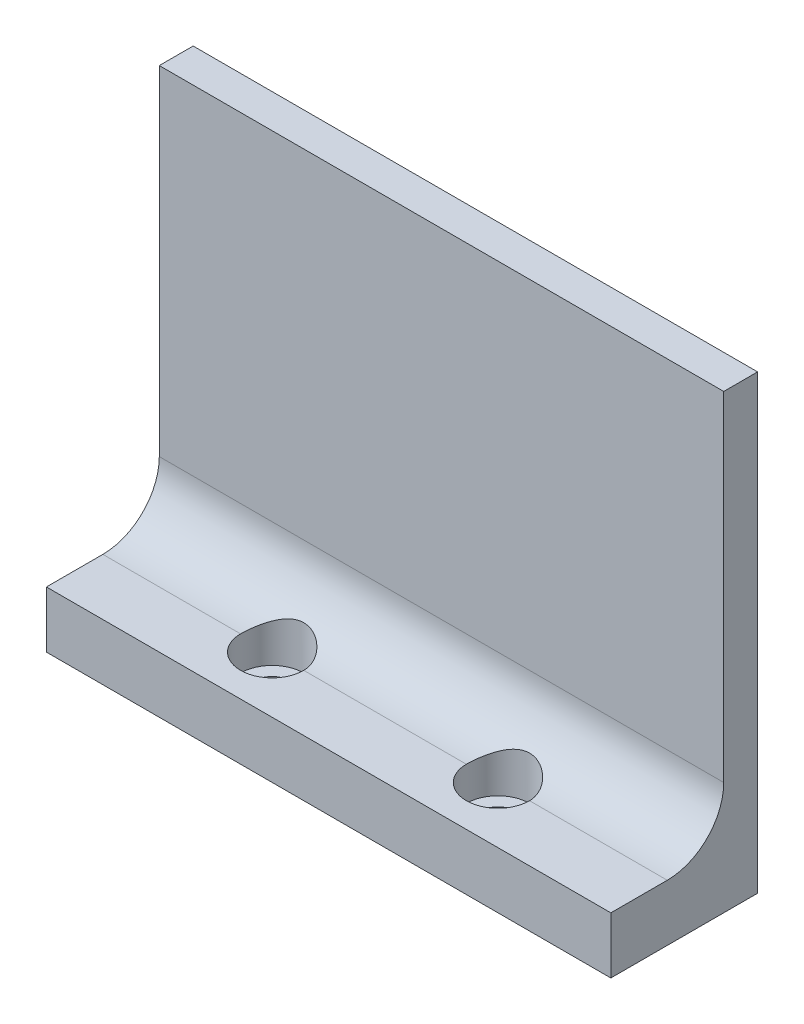
ISO-10303-21;
HEADER;
FILE_DESCRIPTION(('STEP AP214'),'2;1');
FILE_NAME('part.step','',(''),(''),'','','');
FILE_SCHEMA(('AUTOMOTIVE_DESIGN { 1 0 10303 214 1 1 1 1 }'));
ENDSEC;
DATA;
#1=APPLICATION_CONTEXT('core data for automotive mechanical design processes');
#2=APPLICATION_PROTOCOL_DEFINITION('international standard','automotive_design',2000,#1);
#3=PRODUCT_CONTEXT('',#1,'mechanical');
#4=PRODUCT('Part','Part','',(#3));
#5=PRODUCT_RELATED_PRODUCT_CATEGORY('part','',(#4));
#6=PRODUCT_DEFINITION_FORMATION('','',#4);
#7=PRODUCT_DEFINITION_CONTEXT('part definition',#1,'design');
#8=PRODUCT_DEFINITION('design','',#6,#7);
#9=PRODUCT_DEFINITION_SHAPE('','',#8);
#10=(LENGTH_UNIT() NAMED_UNIT(*) SI_UNIT(.MILLI.,.METRE.));
#11=(NAMED_UNIT(*) PLANE_ANGLE_UNIT() SI_UNIT($,.RADIAN.));
#12=(NAMED_UNIT(*) SI_UNIT($,.STERADIAN.) SOLID_ANGLE_UNIT());
#13=UNCERTAINTY_MEASURE_WITH_UNIT(LENGTH_MEASURE(1.E-05),#10,'distance_accuracy_value','');
#14=(GEOMETRIC_REPRESENTATION_CONTEXT(3) GLOBAL_UNCERTAINTY_ASSIGNED_CONTEXT((#13)) GLOBAL_UNIT_ASSIGNED_CONTEXT((#10,
#11,#12)) REPRESENTATION_CONTEXT('',''));
#15=CARTESIAN_POINT('',(0.,0.,0.));
#16=DIRECTION('',(0.,0.,1.));
#17=DIRECTION('',(1.,0.,0.));
#18=AXIS2_PLACEMENT_3D('',#15,#16,#17);
#19=CARTESIAN_POINT('',(30.,0.,-9.99999999999999));
#20=DIRECTION('',(0.,0.,1.));
#21=DIRECTION('',(1.,0.,0.));
#22=AXIS2_PLACEMENT_3D('',#19,#20,#21);
#23=PLANE('',#22);
#24=DIRECTION('',(0.,1.,0.));
#25=VECTOR('',#24,1.);
#26=CARTESIAN_POINT('',(-10.,0.,-10.));
#27=LINE('',#26,#25);
#28=CARTESIAN_POINT('',(-10.,10.,-10.));
#29=VERTEX_POINT('',#28);
#30=CARTESIAN_POINT('',(-10.,40.,-10.));
#31=VERTEX_POINT('',#30);
#32=EDGE_CURVE('E143',#29,#31,#27,.T.);
#33=ORIENTED_EDGE('',*,*,#32,.F.);
#34=DIRECTION('',(-1.,0.,0.));
#35=VECTOR('',#34,1.);
#36=CARTESIAN_POINT('',(30.,10.,-9.99999999999999));
#37=LINE('',#36,#35);
#38=CARTESIAN_POINT('',(40.,10.,-10.));
#39=VERTEX_POINT('',#38);
#40=EDGE_CURVE('E48',#29,#39,#37,.F.);
#41=ORIENTED_EDGE('',*,*,#40,.T.);
#42=DIRECTION('',(0.,-1.,0.));
#43=VECTOR('',#42,1.);
#44=CARTESIAN_POINT('',(40.,40.,-9.99999999999999));
#45=LINE('',#44,#43);
#46=CARTESIAN_POINT('',(40.,40.,-9.99999999999999));
#47=VERTEX_POINT('',#46);
#48=EDGE_CURVE('E137',#47,#39,#45,.T.);
#49=ORIENTED_EDGE('',*,*,#48,.F.);
#50=DIRECTION('',(-1.,0.,0.));
#51=VECTOR('',#50,1.);
#52=CARTESIAN_POINT('',(30.,40.,-9.99999999999999));
#53=LINE('',#52,#51);
#54=EDGE_CURVE('E153',#47,#31,#53,.T.);
#55=ORIENTED_EDGE('',*,*,#54,.T.);
#56=EDGE_LOOP('',(#33,#41,#49,#55));
#57=FACE_BOUND('',#56,.T.);
#58=ADVANCED_FACE('F32',(#57),#23,.T.);
#59=CARTESIAN_POINT('',(5.,5.,-5.));
#60=DIRECTION('',(0.,-1.,0.));
#61=DIRECTION('',(0.,0.,-1.));
#62=AXIS2_PLACEMENT_3D('',#59,#60,#61);
#63=CYLINDRICAL_SURFACE('',#62,1.6);
#64=CARTESIAN_POINT('',(5.,0.,-5.));
#65=DIRECTION('',(0.,1.,0.));
#66=DIRECTION('',(0.,0.,1.));
#67=AXIS2_PLACEMENT_3D('',#64,#65,#66);
#68=CIRCLE('',#67,1.6);
#69=CARTESIAN_POINT('',(5.,0.,-3.4));
#70=VERTEX_POINT('',#69);
#71=EDGE_CURVE('E115',#70,#70,#68,.T.);
#72=ORIENTED_EDGE('',*,*,#71,.F.);
#73=EDGE_LOOP('',(#72));
#74=FACE_BOUND('',#73,.T.);
#75=CARTESIAN_POINT('',(5.,2.,-5.));
#76=DIRECTION('',(0.,1.,0.));
#77=DIRECTION('',(0.,0.,1.));
#78=AXIS2_PLACEMENT_3D('',#75,#76,#77);
#79=CIRCLE('',#78,1.6);
#80=CARTESIAN_POINT('',(5.,2.,-3.4));
#81=VERTEX_POINT('',#80);
#82=EDGE_CURVE('E175',#81,#81,#79,.T.);
#83=ORIENTED_EDGE('',*,*,#82,.T.);
#84=EDGE_LOOP('',(#83));
#85=FACE_BOUND('',#84,.T.);
#86=ADVANCED_FACE('F215',(#74,#85),#63,.F.);
#87=CARTESIAN_POINT('',(25.,5.,-5.));
#88=DIRECTION('',(0.,-1.,0.));
#89=DIRECTION('',(0.,0.,-1.));
#90=AXIS2_PLACEMENT_3D('',#87,#88,#89);
#91=CYLINDRICAL_SURFACE('',#90,1.6);
#92=CARTESIAN_POINT('',(25.,0.,-5.));
#93=DIRECTION('',(0.,1.,0.));
#94=DIRECTION('',(0.,0.,1.));
#95=AXIS2_PLACEMENT_3D('',#92,#93,#94);
#96=CIRCLE('',#95,1.6);
#97=CARTESIAN_POINT('',(25.,0.,-3.4));
#98=VERTEX_POINT('',#97);
#99=EDGE_CURVE('E172',#98,#98,#96,.T.);
#100=ORIENTED_EDGE('',*,*,#99,.F.);
#101=EDGE_LOOP('',(#100));
#102=FACE_BOUND('',#101,.T.);
#103=CARTESIAN_POINT('',(25.,2.,-5.));
#104=DIRECTION('',(0.,1.,0.));
#105=DIRECTION('',(0.,0.,1.));
#106=AXIS2_PLACEMENT_3D('',#103,#104,#105);
#107=CIRCLE('',#106,1.6);
#108=CARTESIAN_POINT('',(25.,2.,-3.4));
#109=VERTEX_POINT('',#108);
#110=EDGE_CURVE('E163',#109,#109,#107,.T.);
#111=ORIENTED_EDGE('',*,*,#110,.T.);
#112=EDGE_LOOP('',(#111));
#113=FACE_BOUND('',#112,.T.);
#114=ADVANCED_FACE('F211',(#102,#113),#91,.F.);
#115=CARTESIAN_POINT('',(0.,5.,0.));
#116=DIRECTION('',(0.,-1.,0.));
#117=DIRECTION('',(0.,0.,-1.));
#118=AXIS2_PLACEMENT_3D('',#115,#116,#117);
#119=PLANE('',#118);
#120=DIRECTION('',(0.,0.,1.));
#121=VECTOR('',#120,1.);
#122=CARTESIAN_POINT('',(40.,5.,-10.));
#123=LINE('',#122,#121);
#124=CARTESIAN_POINT('',(40.,5.,-4.99999999999999));
#125=VERTEX_POINT('',#124);
#126=CARTESIAN_POINT('',(40.,5.,0.));
#127=VERTEX_POINT('',#126);
#128=EDGE_CURVE('E129',#125,#127,#123,.T.);
#129=ORIENTED_EDGE('',*,*,#128,.F.);
#130=DIRECTION('',(-1.,0.,0.));
#131=VECTOR('',#130,1.);
#132=CARTESIAN_POINT('',(0.,5.,-5.));
#133=LINE('',#132,#131);
#134=CARTESIAN_POINT('',(27.8,5.,-4.99999999999999));
#135=VERTEX_POINT('',#134);
#136=EDGE_CURVE('E187',#125,#135,#133,.T.);
#137=ORIENTED_EDGE('',*,*,#136,.T.);
#138=CARTESIAN_POINT('',(25.,5.,-5.));
#139=DIRECTION('',(0.,1.,0.));
#140=DIRECTION('',(0.,0.,1.));
#141=AXIS2_PLACEMENT_3D('',#138,#139,#140);
#142=CIRCLE('',#141,2.8);
#143=CARTESIAN_POINT('',(22.2,5.,-4.99999999999999));
#144=VERTEX_POINT('',#143);
#145=EDGE_CURVE('E155',#144,#135,#142,.T.);
#146=ORIENTED_EDGE('',*,*,#145,.F.);
#147=DIRECTION('',(-1.,0.,0.));
#148=VECTOR('',#147,1.);
#149=CARTESIAN_POINT('',(0.,5.,-5.));
#150=LINE('',#149,#148);
#151=CARTESIAN_POINT('',(7.8,5.,-5.));
#152=VERTEX_POINT('',#151);
#153=EDGE_CURVE('E185',#144,#152,#150,.T.);
#154=ORIENTED_EDGE('',*,*,#153,.T.);
#155=CARTESIAN_POINT('',(5.,5.,-5.));
#156=DIRECTION('',(0.,1.,0.));
#157=DIRECTION('',(0.,0.,1.));
#158=AXIS2_PLACEMENT_3D('',#155,#156,#157);
#159=CIRCLE('',#158,2.8);
#160=CARTESIAN_POINT('',(2.2,5.,-5.));
#161=VERTEX_POINT('',#160);
#162=EDGE_CURVE('E164',#161,#152,#159,.T.);
#163=ORIENTED_EDGE('',*,*,#162,.F.);
#164=DIRECTION('',(-1.,0.,0.));
#165=VECTOR('',#164,1.);
#166=CARTESIAN_POINT('',(0.,5.,-5.));
#167=LINE('',#166,#165);
#168=CARTESIAN_POINT('',(-10.,5.,-5.));
#169=VERTEX_POINT('',#168);
#170=EDGE_CURVE('E178',#161,#169,#167,.T.);
#171=ORIENTED_EDGE('',*,*,#170,.T.);
#172=DIRECTION('',(0.,0.,-1.));
#173=VECTOR('',#172,1.);
#174=CARTESIAN_POINT('',(-10.,5.,0.));
#175=LINE('',#174,#173);
#176=CARTESIAN_POINT('',(-10.,5.,0.));
#177=VERTEX_POINT('',#176);
#178=EDGE_CURVE('E141',#177,#169,#175,.T.);
#179=ORIENTED_EDGE('',*,*,#178,.F.);
#180=DIRECTION('',(1.,0.,0.));
#181=VECTOR('',#180,1.);
#182=CARTESIAN_POINT('',(0.,5.,0.));
#183=LINE('',#182,#181);
#184=EDGE_CURVE('E114',#177,#127,#183,.T.);
#185=ORIENTED_EDGE('',*,*,#184,.T.);
#186=EDGE_LOOP('',(#129,#137,#146,#154,#163,#171,#179,#185));
#187=FACE_BOUND('',#186,.T.);
#188=ADVANCED_FACE('F214',(#187),#119,.F.);
#189=CARTESIAN_POINT('',(0.,0.,0.));
#190=DIRECTION('',(0.,-1.,0.));
#191=DIRECTION('',(0.,0.,-1.));
#192=AXIS2_PLACEMENT_3D('',#189,#190,#191);
#193=PLANE('',#192);
#194=DIRECTION('',(1.,0.,0.));
#195=VECTOR('',#194,1.);
#196=CARTESIAN_POINT('',(0.,0.,0.));
#197=LINE('',#196,#195);
#198=CARTESIAN_POINT('',(-10.,0.,0.));
#199=VERTEX_POINT('',#198);
#200=CARTESIAN_POINT('',(40.,0.,0.));
#201=VERTEX_POINT('',#200);
#202=EDGE_CURVE('E104',#199,#201,#197,.T.);
#203=ORIENTED_EDGE('',*,*,#202,.F.);
#204=DIRECTION('',(0.,0.,1.));
#205=VECTOR('',#204,1.);
#206=CARTESIAN_POINT('',(-10.,0.,-10.));
#207=LINE('',#206,#205);
#208=CARTESIAN_POINT('',(-10.,0.,-13.));
#209=VERTEX_POINT('',#208);
#210=EDGE_CURVE('E151',#209,#199,#207,.T.);
#211=ORIENTED_EDGE('',*,*,#210,.F.);
#212=DIRECTION('',(-1.,0.,0.));
#213=VECTOR('',#212,1.);
#214=CARTESIAN_POINT('',(30.,0.,-13.));
#215=LINE('',#214,#213);
#216=CARTESIAN_POINT('',(40.,0.,-13.));
#217=VERTEX_POINT('',#216);
#218=EDGE_CURVE('E121',#217,#209,#215,.T.);
#219=ORIENTED_EDGE('',*,*,#218,.F.);
#220=DIRECTION('',(0.,0.,-1.));
#221=VECTOR('',#220,1.);
#222=CARTESIAN_POINT('',(40.,0.,0.));
#223=LINE('',#222,#221);
#224=EDGE_CURVE('E118',#201,#217,#223,.T.);
#225=ORIENTED_EDGE('',*,*,#224,.F.);
#226=EDGE_LOOP('',(#203,#211,#219,#225));
#227=FACE_BOUND('',#226,.T.);
#228=ORIENTED_EDGE('',*,*,#71,.T.);
#229=EDGE_LOOP('',(#228));
#230=FACE_BOUND('',#229,.T.);
#231=ORIENTED_EDGE('',*,*,#99,.T.);
#232=EDGE_LOOP('',(#231));
#233=FACE_BOUND('',#232,.T.);
#234=ADVANCED_FACE('F119',(#227,#230,#233),#193,.T.);
#235=CARTESIAN_POINT('',(0.,5.,0.));
#236=DIRECTION('',(0.,0.,-1.));
#237=DIRECTION('',(-1.,0.,0.));
#238=AXIS2_PLACEMENT_3D('',#235,#236,#237);
#239=PLANE('',#238);
#240=ORIENTED_EDGE('',*,*,#202,.T.);
#241=DIRECTION('',(0.,-1.,0.));
#242=VECTOR('',#241,1.);
#243=CARTESIAN_POINT('',(40.,5.,0.));
#244=LINE('',#243,#242);
#245=EDGE_CURVE('E108',#127,#201,#244,.T.);
#246=ORIENTED_EDGE('',*,*,#245,.F.);
#247=ORIENTED_EDGE('',*,*,#184,.F.);
#248=DIRECTION('',(0.,1.,0.));
#249=VECTOR('',#248,1.);
#250=CARTESIAN_POINT('',(-10.,0.,0.));
#251=LINE('',#250,#249);
#252=EDGE_CURVE('E110',#199,#177,#251,.T.);
#253=ORIENTED_EDGE('',*,*,#252,.F.);
#254=EDGE_LOOP('',(#240,#246,#247,#253));
#255=FACE_BOUND('',#254,.T.);
#256=ADVANCED_FACE('F106',(#255),#239,.F.);
#257=CARTESIAN_POINT('',(25.,2.,-5.));
#258=DIRECTION('',(0.,1.,0.));
#259=DIRECTION('',(0.,0.,1.));
#260=AXIS2_PLACEMENT_3D('',#257,#258,#259);
#261=CYLINDRICAL_SURFACE('',#260,2.8);
#262=CARTESIAN_POINT('',(25.,2.,-5.));
#263=DIRECTION('',(0.,1.,0.));
#264=DIRECTION('',(0.,0.,1.));
#265=AXIS2_PLACEMENT_3D('',#262,#263,#264);
#266=CIRCLE('',#265,2.8);
#267=CARTESIAN_POINT('',(25.,2.,-2.2));
#268=VERTEX_POINT('',#267);
#269=EDGE_CURVE('E167',#268,#268,#266,.T.);
#270=ORIENTED_EDGE('',*,*,#269,.F.);
#271=EDGE_LOOP('',(#270));
#272=FACE_BOUND('',#271,.T.);
#273=ORIENTED_EDGE('',*,*,#145,.T.);
#274=CARTESIAN_POINT('',(27.8,5.,-4.99999999999999));
#275=CARTESIAN_POINT('',(27.8000126192588,4.99998601312472,-5.07279241567021));
#276=CARTESIAN_POINT('',(27.7971617749903,5.0015892331611,-5.14557563720953));
#277=CARTESIAN_POINT('',(27.7858311141548,5.00792481182699,-5.29053262710298));
#278=CARTESIAN_POINT('',(27.7773539108875,5.01265571772254,-5.36270666265453));
#279=CARTESIAN_POINT('',(27.754926055572,5.02510951388782,-5.50555509390766));
#280=CARTESIAN_POINT('',(27.7410037349057,5.03281691464609,-5.57623528738965));
#281=CARTESIAN_POINT('',(27.7078700747856,5.0510232543311,-5.71596214610273));
#282=CARTESIAN_POINT('',(27.6886583397865,5.06152240202423,-5.78500868874901));
#283=CARTESIAN_POINT('',(27.6234613019935,5.09681823866923,-5.98880111496992));
#284=CARTESIAN_POINT('',(27.5698596709923,5.12544467793267,-6.12053955595061));
#285=CARTESIAN_POINT('',(27.4443766963702,5.19041538249203,-6.37293869664888));
#286=CARTESIAN_POINT('',(27.3724748746711,5.2267682862057,-6.49358677892571));
#287=CARTESIAN_POINT('',(27.2068119832663,5.30698414120924,-6.72980047729092));
#288=CARTESIAN_POINT('',(27.1118753202332,5.3511942070472,-6.84442330056215));
#289=CARTESIAN_POINT('',(26.9054330895384,5.44126720443915,-7.05701658684001));
#290=CARTESIAN_POINT('',(26.7939118046691,5.48713167229175,-7.15497106239085));
#291=CARTESIAN_POINT('',(26.5437776406316,5.58090114724058,-7.3417016232965));
#292=CARTESIAN_POINT('',(26.4035556704179,5.62852649346677,-7.42848023070925));
#293=CARTESIAN_POINT('',(26.107759278362,5.71429715607025,-7.57684668047028));
#294=CARTESIAN_POINT('',(25.952207894504,5.75245640403028,-7.6384716296407));
#295=CARTESIAN_POINT('',(25.6641729510852,5.80648046491585,-7.72329985246292));
#296=CARTESIAN_POINT('',(25.5338435971426,5.82536420171947,-7.75189401609167));
#297=CARTESIAN_POINT('',(25.269308952908,5.85087139202225,-7.79021262840044));
#298=CARTESIAN_POINT('',(25.1351076393797,5.8575069997297,-7.79995578399908));
#299=CARTESIAN_POINT('',(24.8665440392473,5.85756676689865,-7.80004397547245));
#300=CARTESIAN_POINT('',(24.7321817474793,5.8509755061371,-7.79036637012489));
#301=CARTESIAN_POINT('',(24.4673471502753,5.82551838594795,-7.75212819857548));
#302=CARTESIAN_POINT('',(24.3368773998415,5.80664464214648,-7.72355550304301));
#303=CARTESIAN_POINT('',(24.0831298088093,5.75911696405303,-7.64893207360715));
#304=CARTESIAN_POINT('',(23.9598458821051,5.730471451246,-7.60289638580846));
#305=CARTESIAN_POINT('',(23.7223493578851,5.66649310264979,-7.49492482660402));
#306=CARTESIAN_POINT('',(23.608140498645,5.63115753110378,-7.43298244679016));
#307=CARTESIAN_POINT('',(23.3733378850603,5.55117731196458,-7.28389382073814));
#308=CARTESIAN_POINT('',(23.2544760380035,5.50593744769174,-7.1943338040606));
#309=CARTESIAN_POINT('',(23.0323764514554,5.41510532041184,-6.9976270304732));
#310=CARTESIAN_POINT('',(22.9291528339514,5.36951277750616,-6.8904645576367));
#311=CARTESIAN_POINT('',(22.7303131703048,5.27740454575842,-6.64789611393537));
#312=CARTESIAN_POINT('',(22.636645208127,5.23129790967822,-6.510703856212));
#313=CARTESIAN_POINT('',(22.5148836239945,5.1694098427908,-6.29272605422631));
#314=CARTESIAN_POINT('',(22.4774257996207,5.14999582570145,-6.21805239947648));
#315=CARTESIAN_POINT('',(22.4091279558927,5.11412555441173,-6.06507429899999));
#316=CARTESIAN_POINT('',(22.3782838655198,5.09766748172808,-5.9867721230844));
#317=CARTESIAN_POINT('',(22.3263401221466,5.06968274166836,-5.83505728422271));
#318=CARTESIAN_POINT('',(22.304576984013,5.05782867024697,-5.76193119148331));
#319=CARTESIAN_POINT('',(22.2670219917908,5.03724640932448,-5.61373676298384));
#320=CARTESIAN_POINT('',(22.2512290526789,5.02851765184447,-5.5386687827943));
#321=CARTESIAN_POINT('',(22.2257590244483,5.01439137660924,-5.38671731526305));
#322=CARTESIAN_POINT('',(22.2161196070238,5.00901438288609,-5.30982557845582));
#323=CARTESIAN_POINT('',(22.2032294739358,5.00180823793576,-5.15529306996077));
#324=CARTESIAN_POINT('',(22.1999830569199,4.99998147389048,-5.07765182953498));
#325=CARTESIAN_POINT('',(22.2,5.,-4.99999999999999));
#326=B_SPLINE_CURVE_WITH_KNOTS('',3,(#274,#275,#276,#277,#278,#279,#280,#281,#282,#283,#284,
#285,#286,#287,#288,#289,#290,#291,#292,#293,#294,#295,#296,#297,#298,#299,#300,#301,#302,#303,
#304,#305,#306,#307,#308,#309,#310,#311,#312,#313,#314,#315,#316,#317,#318,#319,#320,#321,#322,
#323,#324,#325),.UNSPECIFIED.,.F.,.F.,(4,2,2,2,2,2,2,2,2,2,2,2,2,2,2,2,2,2,2,2,2,2,2,2,2,4),(0.,
0.218288596011021,0.436475873447966,0.653542692758751,0.870625748858909,1.30376844272026,
1.73739797466487,2.20129948349906,2.66564346594372,3.17801869585316,3.68963531102425,
4.0921540282531,4.49427309816507,4.896861241171,5.29970806888901,5.70220858947327,
6.10487406096021,6.5696422896756,7.03482775371848,7.54903613430851,7.80603100005663,
8.0628672181312,8.29419957513107,8.52548986958242,8.75818287120413,8.9910322820294),.UNSPECIFIED.);
#327=EDGE_CURVE('E191',#135,#144,#326,.T.);
#328=ORIENTED_EDGE('',*,*,#327,.T.);
#329=EDGE_LOOP('',(#273,#328));
#330=FACE_BOUND('',#329,.T.);
#331=ADVANCED_FACE('F204',(#272,#330),#261,.F.);
#332=CARTESIAN_POINT('',(25.,2.,-5.));
#333=DIRECTION('',(0.,1.,0.));
#334=DIRECTION('',(0.,0.,1.));
#335=AXIS2_PLACEMENT_3D('',#332,#333,#334);
#336=PLANE('',#335);
#337=ORIENTED_EDGE('',*,*,#110,.F.);
#338=EDGE_LOOP('',(#337));
#339=FACE_BOUND('',#338,.T.);
#340=ORIENTED_EDGE('',*,*,#269,.T.);
#341=EDGE_LOOP('',(#340));
#342=FACE_BOUND('',#341,.T.);
#343=ADVANCED_FACE('F209',(#339,#342),#336,.T.);
#344=CARTESIAN_POINT('',(5.,2.,-5.));
#345=DIRECTION('',(0.,1.,0.));
#346=DIRECTION('',(0.,0.,1.));
#347=AXIS2_PLACEMENT_3D('',#344,#345,#346);
#348=CYLINDRICAL_SURFACE('',#347,2.8);
#349=CARTESIAN_POINT('',(5.,2.,-5.));
#350=DIRECTION('',(0.,1.,0.));
#351=DIRECTION('',(0.,0.,1.));
#352=AXIS2_PLACEMENT_3D('',#349,#350,#351);
#353=CIRCLE('',#352,2.8);
#354=CARTESIAN_POINT('',(5.,2.,-2.2));
#355=VERTEX_POINT('',#354);
#356=EDGE_CURVE('E160',#355,#355,#353,.T.);
#357=ORIENTED_EDGE('',*,*,#356,.F.);
#358=EDGE_LOOP('',(#357));
#359=FACE_BOUND('',#358,.T.);
#360=ORIENTED_EDGE('',*,*,#162,.T.);
#361=CARTESIAN_POINT('',(7.8,5.,-5.));
#362=CARTESIAN_POINT('',(7.80001261925879,4.99998601312472,-5.07279241567022));
#363=CARTESIAN_POINT('',(7.79716177499028,5.0015892331611,-5.14557563720954));
#364=CARTESIAN_POINT('',(7.78583111415482,5.00792481182699,-5.29053262710298));
#365=CARTESIAN_POINT('',(7.77735391088753,5.01265571772254,-5.36270666265454));
#366=CARTESIAN_POINT('',(7.75492605557198,5.02510951388782,-5.50555509390767));
#367=CARTESIAN_POINT('',(7.74100373490567,5.03281691464609,-5.57623528738966));
#368=CARTESIAN_POINT('',(7.70787007478559,5.0510232543311,-5.71596214610274));
#369=CARTESIAN_POINT('',(7.68865833978646,5.06152240202423,-5.78500868874902));
#370=CARTESIAN_POINT('',(7.6234613019935,5.09681823866923,-5.98880111496993));
#371=CARTESIAN_POINT('',(7.56985967099229,5.12544467793267,-6.12053955595062));
#372=CARTESIAN_POINT('',(7.44437669637023,5.19041538249203,-6.37293869664889));
#373=CARTESIAN_POINT('',(7.37247487467112,5.2267682862057,-6.49358677892572));
#374=CARTESIAN_POINT('',(7.2068119832663,5.30698414120924,-6.72980047729093));
#375=CARTESIAN_POINT('',(7.11187532023315,5.3511942070472,-6.84442330056216));
#376=CARTESIAN_POINT('',(6.90543308953844,5.44126720443915,-7.05701658684002));
#377=CARTESIAN_POINT('',(6.79391180466908,5.48713167229175,-7.15497106239085));
#378=CARTESIAN_POINT('',(6.54377764063163,5.58090114724057,-7.34170162329651));
#379=CARTESIAN_POINT('',(6.40355567041787,5.62852649346676,-7.42848023070925));
#380=CARTESIAN_POINT('',(6.10775927836195,5.71429715607025,-7.57684668047029));
#381=CARTESIAN_POINT('',(5.95220789450394,5.75245640403028,-7.63847162964071));
#382=CARTESIAN_POINT('',(5.66417295108517,5.80648046491585,-7.72329985246293));
#383=CARTESIAN_POINT('',(5.53384359714258,5.82536420171947,-7.75189401609168));
#384=CARTESIAN_POINT('',(5.26930895290803,5.85087139202225,-7.79021262840044));
#385=CARTESIAN_POINT('',(5.13510763937967,5.8575069997297,-7.79995578399908));
#386=CARTESIAN_POINT('',(4.86654403924724,5.85756676689864,-7.80004397547245));
#387=CARTESIAN_POINT('',(4.73218174747926,5.8509755061371,-7.79036637012489));
#388=CARTESIAN_POINT('',(4.46734715027533,5.82551838594795,-7.75212819857548));
#389=CARTESIAN_POINT('',(4.33687739984149,5.80664464214648,-7.723555503043));
#390=CARTESIAN_POINT('',(4.08312980880932,5.75911696405302,-7.64893207360715));
#391=CARTESIAN_POINT('',(3.95984588210504,5.730471451246,-7.60289638580845));
#392=CARTESIAN_POINT('',(3.7223493578851,5.66649310264978,-7.49492482660402));
#393=CARTESIAN_POINT('',(3.608140498645,5.63115753110377,-7.43298244679016));
#394=CARTESIAN_POINT('',(3.37333788506029,5.55117731196457,-7.28389382073813));
#395=CARTESIAN_POINT('',(3.2544760380035,5.50593744769173,-7.1943338040606));
#396=CARTESIAN_POINT('',(3.03237645145544,5.41510532041184,-6.99762703047319));
#397=CARTESIAN_POINT('',(2.92915283395135,5.36951277750616,-6.89046455763669));
#398=CARTESIAN_POINT('',(2.73031317030476,5.27740454575841,-6.64789611393536));
#399=CARTESIAN_POINT('',(2.63664520812703,5.23129790967821,-6.51070385621199));
#400=CARTESIAN_POINT('',(2.51488362399448,5.16940984279079,-6.2927260542263));
#401=CARTESIAN_POINT('',(2.47742579962072,5.14999582570144,-6.21805239947647));
#402=CARTESIAN_POINT('',(2.40912795589269,5.11412555441173,-6.06507429899998));
#403=CARTESIAN_POINT('',(2.37828386551976,5.09766748172807,-5.98677212308439));
#404=CARTESIAN_POINT('',(2.32634012214659,5.06968274166836,-5.8350572842227));
#405=CARTESIAN_POINT('',(2.30457698401303,5.05782867024697,-5.7619311914833));
#406=CARTESIAN_POINT('',(2.26702199179079,5.03724640932448,-5.61373676298383));
#407=CARTESIAN_POINT('',(2.25122905267889,5.02851765184447,-5.5386687827943));
#408=CARTESIAN_POINT('',(2.2257590244483,5.01439137660924,-5.38671731526305));
#409=CARTESIAN_POINT('',(2.21611960702375,5.00901438288608,-5.30982557845581));
#410=CARTESIAN_POINT('',(2.20322947393583,5.00180823793576,-5.15529306996077));
#411=CARTESIAN_POINT('',(2.19998305691991,4.99998147389048,-5.07765182953498));
#412=CARTESIAN_POINT('',(2.2,5.,-5.));
#413=B_SPLINE_CURVE_WITH_KNOTS('',3,(#361,#362,#363,#364,#365,#366,#367,#368,#369,#370,#371,
#372,#373,#374,#375,#376,#377,#378,#379,#380,#381,#382,#383,#384,#385,#386,#387,#388,#389,#390,
#391,#392,#393,#394,#395,#396,#397,#398,#399,#400,#401,#402,#403,#404,#405,#406,#407,#408,#409,
#410,#411,#412),.UNSPECIFIED.,.F.,.F.,(4,2,2,2,2,2,2,2,2,2,2,2,2,2,2,2,2,2,2,2,2,2,2,2,2,4),(0.,
0.218288596011023,0.436475873447968,0.653542692758753,0.870625748858912,1.30376844272026,
1.73739797466488,2.20129948349907,2.66564346594372,3.17801869585317,3.68963531102425,
4.0921540282531,4.49427309816508,4.896861241171,5.29970806888902,5.70220858947328,
6.10487406096022,6.56964228967561,7.0348277537185,7.54903613430852,7.80603100005665,
8.06286721813121,8.29419957513108,8.52548986958243,8.75818287120413,8.99103228202939),.UNSPECIFIED.);
#414=EDGE_CURVE('E198',#152,#161,#413,.T.);
#415=ORIENTED_EDGE('',*,*,#414,.T.);
#416=EDGE_LOOP('',(#360,#415));
#417=FACE_BOUND('',#416,.T.);
#418=ADVANCED_FACE('F238',(#359,#417),#348,.F.);
#419=CARTESIAN_POINT('',(5.,2.,-5.));
#420=DIRECTION('',(0.,1.,0.));
#421=DIRECTION('',(0.,0.,1.));
#422=AXIS2_PLACEMENT_3D('',#419,#420,#421);
#423=PLANE('',#422);
#424=ORIENTED_EDGE('',*,*,#82,.F.);
#425=EDGE_LOOP('',(#424));
#426=FACE_BOUND('',#425,.T.);
#427=ORIENTED_EDGE('',*,*,#356,.T.);
#428=EDGE_LOOP('',(#427));
#429=FACE_BOUND('',#428,.T.);
#430=ADVANCED_FACE('F235',(#426,#429),#423,.T.);
#431=CARTESIAN_POINT('',(30.,0.,-13.));
#432=DIRECTION('',(0.,0.,-1.));
#433=DIRECTION('',(-1.,0.,0.));
#434=AXIS2_PLACEMENT_3D('',#431,#432,#433);
#435=PLANE('',#434);
#436=ORIENTED_EDGE('',*,*,#218,.T.);
#437=DIRECTION('',(0.,-1.,0.));
#438=VECTOR('',#437,1.);
#439=CARTESIAN_POINT('',(-10.,0.,-13.));
#440=LINE('',#439,#438);
#441=CARTESIAN_POINT('',(-10.,40.,-13.));
#442=VERTEX_POINT('',#441);
#443=EDGE_CURVE('E148',#442,#209,#440,.T.);
#444=ORIENTED_EDGE('',*,*,#443,.F.);
#445=DIRECTION('',(-1.,0.,0.));
#446=VECTOR('',#445,1.);
#447=CARTESIAN_POINT('',(30.,40.,-13.));
#448=LINE('',#447,#446);
#449=CARTESIAN_POINT('',(40.,40.,-13.));
#450=VERTEX_POINT('',#449);
#451=EDGE_CURVE('E156',#450,#442,#448,.T.);
#452=ORIENTED_EDGE('',*,*,#451,.F.);
#453=DIRECTION('',(0.,1.,0.));
#454=VECTOR('',#453,1.);
#455=CARTESIAN_POINT('',(40.,0.,-13.));
#456=LINE('',#455,#454);
#457=EDGE_CURVE('E125',#217,#450,#456,.T.);
#458=ORIENTED_EDGE('',*,*,#457,.F.);
#459=EDGE_LOOP('',(#436,#444,#452,#458));
#460=FACE_BOUND('',#459,.T.);
#461=ADVANCED_FACE('F237',(#460),#435,.T.);
#462=CARTESIAN_POINT('',(30.,40.,-9.99999999999999));
#463=DIRECTION('',(0.,1.,0.));
#464=DIRECTION('',(0.,0.,1.));
#465=AXIS2_PLACEMENT_3D('',#462,#463,#464);
#466=PLANE('',#465);
#467=ORIENTED_EDGE('',*,*,#451,.T.);
#468=DIRECTION('',(0.,0.,-1.));
#469=VECTOR('',#468,1.);
#470=CARTESIAN_POINT('',(-10.,40.,-10.));
#471=LINE('',#470,#469);
#472=EDGE_CURVE('E145',#31,#442,#471,.T.);
#473=ORIENTED_EDGE('',*,*,#472,.F.);
#474=ORIENTED_EDGE('',*,*,#54,.F.);
#475=DIRECTION('',(0.,0.,1.));
#476=VECTOR('',#475,1.);
#477=CARTESIAN_POINT('',(40.,40.,-13.));
#478=LINE('',#477,#476);
#479=EDGE_CURVE('E134',#450,#47,#478,.T.);
#480=ORIENTED_EDGE('',*,*,#479,.F.);
#481=EDGE_LOOP('',(#467,#473,#474,#480));
#482=FACE_BOUND('',#481,.T.);
#483=ADVANCED_FACE('F233',(#482),#466,.T.);
#484=CARTESIAN_POINT('',(-10.,0.,0.));
#485=DIRECTION('',(-1.,0.,0.));
#486=DIRECTION('',(0.,0.,1.));
#487=AXIS2_PLACEMENT_3D('',#484,#485,#486);
#488=PLANE('',#487);
#489=ORIENTED_EDGE('',*,*,#210,.T.);
#490=ORIENTED_EDGE('',*,*,#252,.T.);
#491=ORIENTED_EDGE('',*,*,#178,.T.);
#492=CARTESIAN_POINT('',(-10.,10.,-5.));
#493=DIRECTION('',(-1.,0.,0.));
#494=DIRECTION('',(0.,0.,1.));
#495=AXIS2_PLACEMENT_3D('',#492,#493,#494);
#496=CIRCLE('',#495,5.);
#497=EDGE_CURVE('E41',#169,#29,#496,.F.);
#498=ORIENTED_EDGE('',*,*,#497,.T.);
#499=ORIENTED_EDGE('',*,*,#32,.T.);
#500=ORIENTED_EDGE('',*,*,#472,.T.);
#501=ORIENTED_EDGE('',*,*,#443,.T.);
#502=EDGE_LOOP('',(#489,#490,#491,#498,#499,#500,#501));
#503=FACE_BOUND('',#502,.T.);
#504=ADVANCED_FACE('F256',(#503),#488,.T.);
#505=CARTESIAN_POINT('',(40.,0.,0.));
#506=DIRECTION('',(1.,0.,0.));
#507=DIRECTION('',(0.,0.,-1.));
#508=AXIS2_PLACEMENT_3D('',#505,#506,#507);
#509=PLANE('',#508);
#510=ORIENTED_EDGE('',*,*,#245,.T.);
#511=ORIENTED_EDGE('',*,*,#224,.T.);
#512=ORIENTED_EDGE('',*,*,#457,.T.);
#513=ORIENTED_EDGE('',*,*,#479,.T.);
#514=ORIENTED_EDGE('',*,*,#48,.T.);
#515=CARTESIAN_POINT('',(40.,10.,-4.99999999999999));
#516=DIRECTION('',(1.,0.,0.));
#517=DIRECTION('',(0.,0.,-1.));
#518=AXIS2_PLACEMENT_3D('',#515,#516,#517);
#519=CIRCLE('',#518,5.);
#520=EDGE_CURVE('E11',#39,#125,#519,.F.);
#521=ORIENTED_EDGE('',*,*,#520,.T.);
#522=ORIENTED_EDGE('',*,*,#128,.T.);
#523=EDGE_LOOP('',(#510,#511,#512,#513,#514,#521,#522));
#524=FACE_BOUND('',#523,.T.);
#525=ADVANCED_FACE('F127',(#524),#509,.T.);
#526=CARTESIAN_POINT('',(0.,10.,-5.));
#527=DIRECTION('',(-1.,0.,0.));
#528=DIRECTION('',(0.,0.,1.));
#529=AXIS2_PLACEMENT_3D('',#526,#527,#528);
#530=CYLINDRICAL_SURFACE('',#529,5.);
#531=ORIENTED_EDGE('',*,*,#520,.F.);
#532=ORIENTED_EDGE('',*,*,#40,.F.);
#533=ORIENTED_EDGE('',*,*,#497,.F.);
#534=ORIENTED_EDGE('',*,*,#170,.F.);
#535=ORIENTED_EDGE('',*,*,#414,.F.);
#536=ORIENTED_EDGE('',*,*,#153,.F.);
#537=ORIENTED_EDGE('',*,*,#327,.F.);
#538=ORIENTED_EDGE('',*,*,#136,.F.);
#539=EDGE_LOOP('',(#531,#532,#533,#534,#535,#536,#537,#538));
#540=FACE_BOUND('',#539,.T.);
#541=ADVANCED_FACE('F34',(#540),#530,.F.);
#542=CLOSED_SHELL('',(#58,#86,#114,#188,#234,#256,#331,#343,#418,#430,#461,#483,#504,#525,#541));
#543=MANIFOLD_SOLID_BREP('B2',#542);
#544=ADVANCED_BREP_SHAPE_REPRESENTATION('',(#18,#543),#14);
#545=SHAPE_DEFINITION_REPRESENTATION(#9,#544);
ENDSEC;
END-ISO-10303-21;
